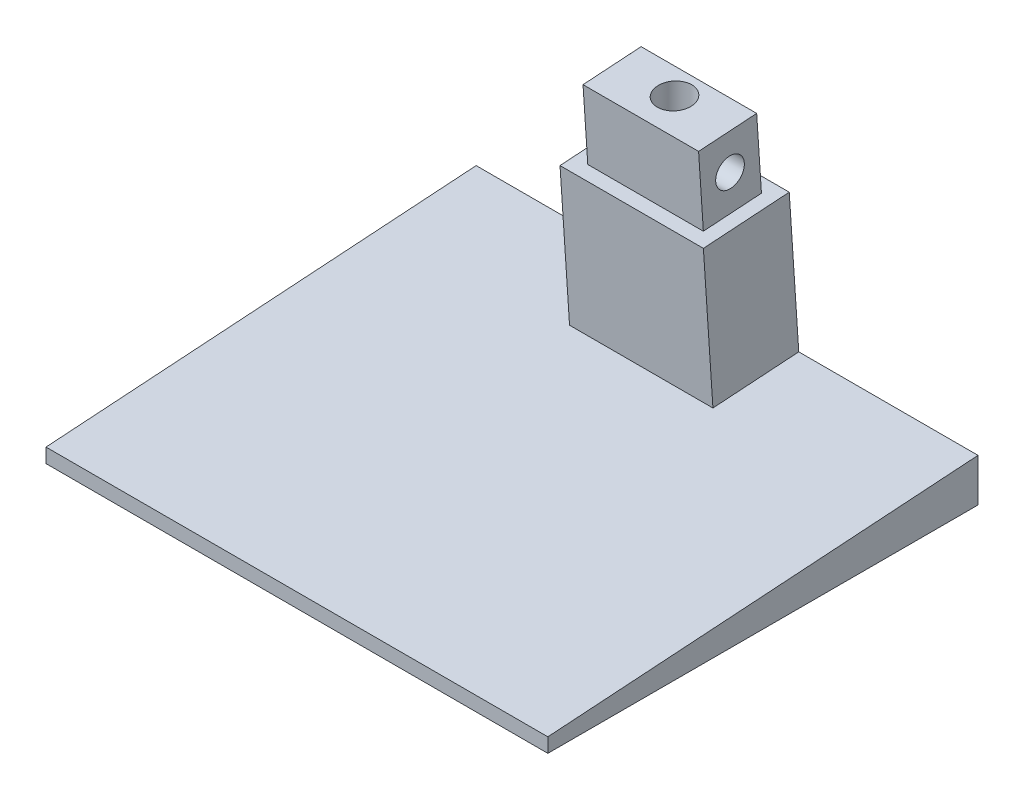
ISO-10303-21;
HEADER;
FILE_DESCRIPTION(('STEP AP214'),'2;1');
FILE_NAME('part.step','',(''),(''),'','','');
FILE_SCHEMA(('AUTOMOTIVE_DESIGN { 1 0 10303 214 1 1 1 1 }'));
ENDSEC;
DATA;
#1=APPLICATION_CONTEXT('core data for automotive mechanical design processes');
#2=APPLICATION_PROTOCOL_DEFINITION('international standard','automotive_design',2000,#1);
#3=PRODUCT_CONTEXT('',#1,'mechanical');
#4=PRODUCT('Part','Part','',(#3));
#5=PRODUCT_RELATED_PRODUCT_CATEGORY('part','',(#4));
#6=PRODUCT_DEFINITION_FORMATION('','',#4);
#7=PRODUCT_DEFINITION_CONTEXT('part definition',#1,'design');
#8=PRODUCT_DEFINITION('design','',#6,#7);
#9=PRODUCT_DEFINITION_SHAPE('','',#8);
#10=(LENGTH_UNIT() NAMED_UNIT(*) SI_UNIT(.MILLI.,.METRE.));
#11=(NAMED_UNIT(*) PLANE_ANGLE_UNIT() SI_UNIT($,.RADIAN.));
#12=(NAMED_UNIT(*) SI_UNIT($,.STERADIAN.) SOLID_ANGLE_UNIT());
#13=UNCERTAINTY_MEASURE_WITH_UNIT(LENGTH_MEASURE(1.E-05),#10,'distance_accuracy_value','');
#14=(GEOMETRIC_REPRESENTATION_CONTEXT(3) GLOBAL_UNCERTAINTY_ASSIGNED_CONTEXT((#13)) GLOBAL_UNIT_ASSIGNED_CONTEXT((#10,
#11,#12)) REPRESENTATION_CONTEXT('',''));
#15=CARTESIAN_POINT('',(0.,0.,0.));
#16=DIRECTION('',(0.,0.,1.));
#17=DIRECTION('',(1.,0.,0.));
#18=AXIS2_PLACEMENT_3D('',#15,#16,#17);
#19=CARTESIAN_POINT('',(87.5,89.5112696382054,-131.674049473811));
#20=DIRECTION('',(0.,-1.,0.));
#21=DIRECTION('',(0.,0.,-1.));
#22=AXIS2_PLACEMENT_3D('',#19,#20,#21);
#23=CYLINDRICAL_SURFACE('',#22,6.);
#24=CARTESIAN_POINT('',(89.042764725023,76.3637872081815,-125.875784474415));
#25=CARTESIAN_POINT('',(89.0427793697814,76.4502100416828,-125.875787073559));
#26=CARTESIAN_POINT('',(89.0513799306623,76.5366598300966,-125.878057289111));
#27=CARTESIAN_POINT('',(89.083725039843,76.7065794961056,-125.88681600111));
#28=CARTESIAN_POINT('',(89.1075283186484,76.7900364856621,-125.893320858536));
#29=CARTESIAN_POINT('',(89.1832372570854,77.0006443697118,-125.914798575622));
#30=CARTESIAN_POINT('',(89.243437313144,77.1244001643221,-125.932504957607));
#31=CARTESIAN_POINT('',(89.3779600846422,77.3626843112569,-125.975074709256));
#32=CARTESIAN_POINT('',(89.4523446075981,77.4771690338521,-125.999969656113));
#33=CARTESIAN_POINT('',(89.5888565013557,77.6714532492909,-126.049053985971));
#34=CARTESIAN_POINT('',(89.6493808497785,77.7527521945163,-126.071855224218));
#35=CARTESIAN_POINT('',(89.7730453914373,77.9122858190956,-126.120879714517));
#36=CARTESIAN_POINT('',(89.8361863734101,77.9905195604697,-126.147104003583));
#37=CARTESIAN_POINT('',(90.0280939689599,78.2216700704762,-126.230871617288));
#38=CARTESIAN_POINT('',(90.159198278557,78.3708380240515,-126.293458472662));
#39=CARTESIAN_POINT('',(90.4232084527442,78.6616777597919,-126.432176748635));
#40=CARTESIAN_POINT('',(90.5561177644259,78.8033315317511,-126.508338958104));
#41=CARTESIAN_POINT('',(90.8207832558745,79.079304043409,-126.674370995999));
#42=CARTESIAN_POINT('',(90.9525401912207,79.213627948104,-126.764230998362));
#43=CARTESIAN_POINT('',(91.2174019077664,79.4792033500319,-126.961396288291));
#44=CARTESIAN_POINT('',(91.3504031756903,79.6101998833002,-127.069186368991));
#45=CARTESIAN_POINT('',(91.6112659568959,79.8633263054801,-127.300503774454));
#46=CARTESIAN_POINT('',(91.7391253889881,79.9854526199212,-127.424037388824));
#47=CARTESIAN_POINT('',(91.9870947799801,80.2187652875163,-127.686763317388));
#48=CARTESIAN_POINT('',(92.1072353404672,80.3299958936156,-127.825886911498));
#49=CARTESIAN_POINT('',(92.3380346710194,80.5399773650568,-128.120396421846));
#50=CARTESIAN_POINT('',(92.4486965539099,80.6387323325334,-128.275776961727));
#51=CARTESIAN_POINT('',(92.6787722450169,80.8393024484906,-128.635257805519));
#52=CARTESIAN_POINT('',(92.795598839608,80.9378707301997,-128.84291973519));
#53=CARTESIAN_POINT('',(92.9539918553426,81.06539346973,-129.170305959201));
#54=CARTESIAN_POINT('',(93.0039949624662,81.1045219955819,-129.282121760007));
#55=CARTESIAN_POINT('',(93.0977471498935,81.1752937160671,-129.510615281535));
#56=CARTESIAN_POINT('',(93.1414992509541,81.2069405310609,-129.627290618472));
#57=CARTESIAN_POINT('',(93.2225070909228,81.2623118351067,-129.866024113515));
#58=CARTESIAN_POINT('',(93.2596967294545,81.2859576984858,-129.988123066503));
#59=CARTESIAN_POINT('',(93.3264588381164,81.3242298199294,-130.235716100821));
#60=CARTESIAN_POINT('',(93.3560353182682,81.3388608320023,-130.36120835617));
#61=CARTESIAN_POINT('',(93.4071191668175,81.3585708354973,-130.614508547043));
#62=CARTESIAN_POINT('',(93.4286305029332,81.3636545287543,-130.742315311395));
#63=CARTESIAN_POINT('',(93.4633180575324,81.3639146926371,-130.99906043758));
#64=CARTESIAN_POINT('',(93.4764954120776,81.3590925139803,-131.127998642747));
#65=CARTESIAN_POINT('',(93.4932904829129,81.3406798063257,-131.368921830528));
#66=CARTESIAN_POINT('',(93.4979281536621,81.3283104923028,-131.48093194983));
#67=CARTESIAN_POINT('',(93.5009621828291,81.2960075283034,-131.703977863105));
#68=CARTESIAN_POINT('',(93.4993565741161,81.2760714959933,-131.815013338941));
#69=CARTESIAN_POINT('',(93.4901335296254,81.2288060987739,-132.035208168448));
#70=CARTESIAN_POINT('',(93.482517965458,81.2014790373079,-132.144368095388));
#71=CARTESIAN_POINT('',(93.4616342523055,81.1397032002427,-132.360116521878));
#72=CARTESIAN_POINT('',(93.4483638882281,81.105251636566,-132.466703996444));
#73=CARTESIAN_POINT('',(93.4012688495116,80.9930475964702,-132.777855056129));
#74=CARTESIAN_POINT('',(93.3599585019667,80.905553038863,-132.977889341243));
#75=CARTESIAN_POINT('',(93.2612093792658,80.7074546362079,-133.361606792118));
#76=CARTESIAN_POINT('',(93.2037679448719,80.5968469816955,-133.545287255341));
#77=CARTESIAN_POINT('',(93.0681019017088,80.3381694064561,-133.919320757166));
#78=CARTESIAN_POINT('',(92.988079998529,80.1870043041771,-134.106872730576));
#79=CARTESIAN_POINT('',(92.8192905058662,79.861578133005,-134.456659360936));
#80=CARTESIAN_POINT('',(92.7305103426524,79.6872837311543,-134.618856728947));
#81=CARTESIAN_POINT('',(92.5873333167502,79.392265093154,-134.85679686639));
#82=CARTESIAN_POINT('',(92.5334304334385,79.2780993836818,-134.941119623344));
#83=CARTESIAN_POINT('',(92.4266626394211,79.0426248235883,-135.100001509976));
#84=CARTESIAN_POINT('',(92.3737979851985,78.9213142367806,-135.17455825223));
#85=CARTESIAN_POINT('',(92.2709855936435,78.6719377474253,-135.313439134306));
#86=CARTESIAN_POINT('',(92.2210351129625,78.5438784215003,-135.377772999432));
#87=CARTESIAN_POINT('',(92.1260328076876,78.2812042048557,-135.495770871212));
#88=CARTESIAN_POINT('',(92.0809813478239,78.1465888271194,-135.549434083687));
#89=CARTESIAN_POINT('',(91.9793551831933,77.8089915767957,-135.667028252658));
#90=CARTESIAN_POINT('',(91.9267140443316,77.6024973131042,-135.724717996542));
#91=CARTESIAN_POINT('',(91.864569417439,77.2856052634995,-135.79126222302));
#92=CARTESIAN_POINT('',(91.8466625809359,77.1788430002456,-135.81010706008));
#93=CARTESIAN_POINT('',(91.8171716104321,76.9634716570328,-135.8408815721));
#94=CARTESIAN_POINT('',(91.8055849237303,76.8548633409968,-135.85281403908));
#95=CARTESIAN_POINT('',(91.7892374263317,76.6358604220556,-135.869592569247));
#96=CARTESIAN_POINT('',(91.7845222145393,76.525458758446,-135.874391297335));
#97=CARTESIAN_POINT('',(91.7823034729202,76.3045085249741,-135.876653422798));
#98=CARTESIAN_POINT('',(91.7847997490606,76.1939599591443,-135.874117017531));
#99=CARTESIAN_POINT('',(91.7968786466895,75.9735946342982,-135.861758507338));
#100=CARTESIAN_POINT('',(91.8064658417063,75.8637783937664,-135.851931700207));
#101=CARTESIAN_POINT('',(91.832258127052,75.6457618156172,-135.825179686174));
#102=CARTESIAN_POINT('',(91.8484665934717,75.5375623315778,-135.808250857935));
#103=CARTESIAN_POINT('',(91.8895205253234,75.3081491301387,-135.76466398234));
#104=CARTESIAN_POINT('',(91.9152716854769,75.1872961862495,-135.736958328515));
#105=CARTESIAN_POINT('',(91.973156659891,74.949370818314,-135.673140467838));
#106=CARTESIAN_POINT('',(92.0052949272056,74.8323010984892,-135.637022392857));
#107=CARTESIAN_POINT('',(92.1093047060666,74.4871221881745,-135.516641012123));
#108=CARTESIAN_POINT('',(92.1887153028853,74.265323350972,-135.420405435627));
#109=CARTESIAN_POINT('',(92.3256899867539,73.9202584002824,-135.240608677925));
#110=CARTESIAN_POINT('',(92.3803542602527,73.7910986693754,-135.165709493764));
#111=CARTESIAN_POINT('',(92.4914022716153,73.5404060087576,-135.005029923144));
#112=CARTESIAN_POINT('',(92.5477864484522,73.4188750507651,-134.919246740795));
#113=CARTESIAN_POINT('',(92.6602804244272,73.1839333960836,-134.737209419358));
#114=CARTESIAN_POINT('',(92.7163903720206,73.0705177109517,-134.640961806031));
#115=CARTESIAN_POINT('',(92.8266074342102,72.8521882355313,-134.438210100854));
#116=CARTESIAN_POINT('',(92.880714158462,72.7472760975411,-134.33170402447));
#117=CARTESIAN_POINT('',(93.0211023470062,72.4777207667161,-134.032118330603));
#118=CARTESIAN_POINT('',(93.1040182999405,72.3214231986065,-133.829735174893));
#119=CARTESIAN_POINT('',(93.2512511650982,72.0393870850299,-133.398809076566));
#120=CARTESIAN_POINT('',(93.3155961124205,71.9136025228997,-133.170306300385));
#121=CARTESIAN_POINT('',(93.4103934427158,71.7140926897276,-132.727801817598));
#122=CARTESIAN_POINT('',(93.4445056970434,71.6353655295972,-132.516855500108));
#123=CARTESIAN_POINT('',(93.4899268206533,71.5067123153371,-132.083968715191));
#124=CARTESIAN_POINT('',(93.5012478753249,71.4567708810244,-131.862034187717));
#125=CARTESIAN_POINT('',(93.498529237956,71.387520504251,-131.41292467587));
#126=CARTESIAN_POINT('',(93.4844213276174,71.3682942224318,-131.185737213986));
#127=CARTESIAN_POINT('',(93.4302619374574,71.3606937006792,-130.733963086497));
#128=CARTESIAN_POINT('',(93.3902069111086,71.3723236789421,-130.509376780696));
#129=CARTESIAN_POINT('',(93.2879786364839,71.4232130103637,-130.078277226406));
#130=CARTESIAN_POINT('',(93.226750302558,71.4613529828175,-129.871400415414));
#131=CARTESIAN_POINT('',(93.0847309061696,71.5609117158367,-129.470404374638));
#132=CARTESIAN_POINT('',(93.0039346214463,71.6223366931415,-129.276288568102));
#133=CARTESIAN_POINT('',(92.8532489773755,71.7430801724324,-128.960500163987));
#134=CARTESIAN_POINT('',(92.7875557916468,71.7973209072322,-128.834798052083));
#135=CARTESIAN_POINT('',(92.6493642410879,71.9141646028293,-128.59124886658));
#136=CARTESIAN_POINT('',(92.5768637357943,71.9767701964709,-128.473404283721));
#137=CARTESIAN_POINT('',(92.3503165129829,72.1758422526004,-128.131564711146));
#138=CARTESIAN_POINT('',(92.1874365471843,72.323392015949,-127.919697282117));
#139=CARTESIAN_POINT('',(91.9002779617966,72.5899890603336,-127.591296443505));
#140=CARTESIAN_POINT('',(91.78026503774,72.7031091021879,-127.465914188388));
#141=CARTESIAN_POINT('',(91.5345807201537,72.9381928294041,-127.229824385662));
#142=CARTESIAN_POINT('',(91.4089098122007,73.0601557564026,-127.119115581958));
#143=CARTESIAN_POINT('',(91.1539565734457,73.3115402025332,-126.912167810475));
#144=CARTESIAN_POINT('',(91.0246822301156,73.4409458111717,-126.815899454946));
#145=CARTESIAN_POINT('',(90.7640802405881,73.7068447910888,-126.637114643248));
#146=CARTESIAN_POINT('',(90.6327534678216,73.843335201836,-126.554592502659));
#147=CARTESIAN_POINT('',(90.3709911767015,74.1226860386984,-126.40336443173));
#148=CARTESIAN_POINT('',(90.2405552481486,74.2655009976631,-126.334574862922));
#149=CARTESIAN_POINT('',(89.9820018081623,74.5603055240463,-126.20959438553));
#150=CARTESIAN_POINT('',(89.853901945097,74.712343133372,-126.153478210891));
#151=CARTESIAN_POINT('',(89.6679133152126,74.9503784169432,-126.078984418349));
#152=CARTESIAN_POINT('',(89.606492278457,75.0320600824545,-126.055624145567));
#153=CARTESIAN_POINT('',(89.4876146696114,75.1994164334142,-126.012479755685));
#154=CARTESIAN_POINT('',(89.4301640780741,75.2850968302593,-125.992700963655));
#155=CARTESIAN_POINT('',(89.3224890452551,75.4604477082431,-125.957258001398));
#156=CARTESIAN_POINT('',(89.2721925454176,75.5500644008068,-125.941551258192));
#157=CARTESIAN_POINT('',(89.1825028913054,75.7351087088759,-125.914590524554));
#158=CARTESIAN_POINT('',(89.1430694267735,75.8305131930963,-125.903320003635));
#159=CARTESIAN_POINT('',(89.0903189526855,75.9991694754137,-125.888600134851));
#160=CARTESIAN_POINT('',(89.0727561513652,76.0709350171623,-125.883835047407));
#161=CARTESIAN_POINT('',(89.0489849773978,76.2163925607287,-125.877429462102));
#162=CARTESIAN_POINT('',(89.0427522350013,76.2900800812092,-125.875782257692));
#163=CARTESIAN_POINT('',(89.042764725023,76.3637872081815,-125.875784474415));
#164=B_SPLINE_CURVE_WITH_KNOTS('',3,(#24,#25,#26,#27,#28,#29,#30,#31,#32,#33,#34,#35,#36,#37,
#38,#39,#40,#41,#42,#43,#44,#45,#46,#47,#48,#49,#50,#51,#52,#53,#54,#55,#56,#57,#58,#59,#60,#61,
#62,#63,#64,#65,#66,#67,#68,#69,#70,#71,#72,#73,#74,#75,#76,#77,#78,#79,#80,#81,#82,#83,#84,#85,
#86,#87,#88,#89,#90,#91,#92,#93,#94,#95,#96,#97,#98,#99,#100,#101,#102,#103,#104,#105,#106,#107,
#108,#109,#110,#111,#112,#113,#114,#115,#116,#117,#118,#119,#120,#121,#122,#123,#124,#125,#126,
#127,#128,#129,#130,#131,#132,#133,#134,#135,#136,#137,#138,#139,#140,#141,#142,#143,#144,#145,
#146,#147,#148,#149,#150,#151,#152,#153,#154,#155,#156,#157,#158,#159,#160,#161,#162,#163),
.UNSPECIFIED.,.T.,.F.,(4,2,2,2,2,2,2,2,2,2,2,2,2,2,2,2,2,2,2,2,2,2,2,2,2,2,2,2,2,2,2,2,2,2,2,2,
2,2,2,2,2,2,2,2,2,2,2,2,2,2,2,2,2,2,2,2,2,2,2,2,2,2,2,2,2,2,2,2,2,4),(0.,0.258939460754341,
0.518885346552173,0.932781526304068,1.34852422929801,1.66002717565653,1.97162471182371,
2.59557280496407,3.22095444692794,3.84588956659066,4.49182688386673,5.13802306949799,
5.78147526952643,6.42471534124918,7.19498086050797,7.58035933677063,7.96555094696234,
8.35442480468114,8.74309341271023,9.13157056013831,9.51999474018696,9.85793018679911,
10.1959721186341,10.5339088195263,10.8719780184876,11.5357161144331,12.1995636930633,
12.9583293394086,13.7182006089462,14.1732450000468,14.6284004256351,15.0831202229894,
15.537873850915,16.1972055767872,16.5265122976487,16.8556859132377,17.1870341220533,
17.5183734156653,17.8499266043396,18.1816490586315,18.5609781932637,18.9405727276454,
19.7006236723498,20.1771706396519,20.6538402715049,21.1302143324428,21.6066807353669,
22.4097193819052,23.2115393300283,23.8917715807372,24.57164004636,25.2533351108627,
25.9351233710986,26.5897451996233,27.2445419253764,27.6995111846975,28.1546239846935,
29.0663676031867,29.6871994571153,30.3079781315173,30.9274758005457,31.5467166515854,
32.1620625057289,32.7809473932841,33.0953051863714,33.4101266070102,33.7215101897899,
34.0317222380737,34.2530395879012,34.4738803418863),.UNSPECIFIED.);
#165=CARTESIAN_POINT('',(89.042764725023,76.3637872081815,-125.875784474415));
#166=VERTEX_POINT('',#165);
#167=EDGE_CURVE('E260',#166,#166,#164,.T.);
#168=ORIENTED_EDGE('',*,*,#167,.F.);
#169=EDGE_LOOP('',(#168));
#170=FACE_BOUND('',#169,.T.);
#171=CARTESIAN_POINT('',(85.957235274977,76.3637872081815,-125.875784474415));
#172=CARTESIAN_POINT('',(85.9572206302185,76.2773643746802,-125.875787073559));
#173=CARTESIAN_POINT('',(85.9486200693376,76.1909145862664,-125.878057289111));
#174=CARTESIAN_POINT('',(85.916274960157,76.0209949202573,-125.88681600111));
#175=CARTESIAN_POINT('',(85.8924716813516,75.9375379307008,-125.893320858536));
#176=CARTESIAN_POINT('',(85.8167627429146,75.7269300466512,-125.914798575622));
#177=CARTESIAN_POINT('',(85.756562686856,75.6031742520409,-125.932504957607));
#178=CARTESIAN_POINT('',(85.6220399153578,75.364890105106,-125.975074709256));
#179=CARTESIAN_POINT('',(85.5476553924019,75.2504053825109,-125.999969656113));
#180=CARTESIAN_POINT('',(85.4111434986443,75.056121167072,-126.049053985971));
#181=CARTESIAN_POINT('',(85.3506191502215,74.9748222218467,-126.071855224218));
#182=CARTESIAN_POINT('',(85.2269546085627,74.8152885972674,-126.120879714517));
#183=CARTESIAN_POINT('',(85.1638136265899,74.7370548558933,-126.147104003583));
#184=CARTESIAN_POINT('',(84.9719060310401,74.5059043458868,-126.230871617288));
#185=CARTESIAN_POINT('',(84.840801721443,74.3567363923115,-126.293458472662));
#186=CARTESIAN_POINT('',(84.5767915472558,74.065896656571,-126.432176748635));
#187=CARTESIAN_POINT('',(84.4438822355741,73.9242428846119,-126.508338958104));
#188=CARTESIAN_POINT('',(84.1792167441255,73.648270372954,-126.674370995999));
#189=CARTESIAN_POINT('',(84.0474598087793,73.513946468259,-126.764230998362));
#190=CARTESIAN_POINT('',(83.7825980922336,73.248371066331,-126.961396288291));
#191=CARTESIAN_POINT('',(83.6495968243098,73.1173745330627,-127.069186368991));
#192=CARTESIAN_POINT('',(83.3887340431041,72.8642481108829,-127.300503774454));
#193=CARTESIAN_POINT('',(83.260874611012,72.7421217964418,-127.424037388824));
#194=CARTESIAN_POINT('',(83.0129052200199,72.5088091288467,-127.686763317388));
#195=CARTESIAN_POINT('',(82.8927646595328,72.3975785227474,-127.825886911498));
#196=CARTESIAN_POINT('',(82.6619653289807,72.1875970513062,-128.120396421846));
#197=CARTESIAN_POINT('',(82.5513034460901,72.0888420838296,-128.275776961727));
#198=CARTESIAN_POINT('',(82.3212277549831,71.8882719678723,-128.635257805519));
#199=CARTESIAN_POINT('',(82.204401160392,71.7897036861633,-128.842919735189));
#200=CARTESIAN_POINT('',(82.0460081446574,71.662180946633,-129.1703059592));
#201=CARTESIAN_POINT('',(81.9960050375338,71.623052420781,-129.282121760006));
#202=CARTESIAN_POINT('',(81.9022528501065,71.5522807002958,-129.510615281535));
#203=CARTESIAN_POINT('',(81.8585007490459,71.5206338853021,-129.627290618472));
#204=CARTESIAN_POINT('',(81.7774929090772,71.4652625812562,-129.866024113514));
#205=CARTESIAN_POINT('',(81.7403032705455,71.4416167178772,-129.988123066503));
#206=CARTESIAN_POINT('',(81.6735411618836,71.4033445964336,-130.235716100821));
#207=CARTESIAN_POINT('',(81.6439646817318,71.3887135843606,-130.36120835617));
#208=CARTESIAN_POINT('',(81.5928808331825,71.3690035808657,-130.614508547043));
#209=CARTESIAN_POINT('',(81.5713694970668,71.3639198876086,-130.742315311395));
#210=CARTESIAN_POINT('',(81.5366819424676,71.3636597237259,-130.999060437579));
#211=CARTESIAN_POINT('',(81.5235045879223,71.3684819023826,-131.127998642747));
#212=CARTESIAN_POINT('',(81.5067095170871,71.3868946100373,-131.368921830528));
#213=CARTESIAN_POINT('',(81.5020718463378,71.3992639240602,-131.48093194983));
#214=CARTESIAN_POINT('',(81.4990378171709,71.4315668880596,-131.703977863105));
#215=CARTESIAN_POINT('',(81.5006434258839,71.4515029203697,-131.815013338941));
#216=CARTESIAN_POINT('',(81.5098664703746,71.498768317589,-132.035208168448));
#217=CARTESIAN_POINT('',(81.5174820345419,71.526095379055,-132.144368095388));
#218=CARTESIAN_POINT('',(81.5383657476945,71.5878712161202,-132.360116521878));
#219=CARTESIAN_POINT('',(81.5516361117719,71.622322779797,-132.466703996444));
#220=CARTESIAN_POINT('',(81.5987311504883,71.7345268198927,-132.777855056129));
#221=CARTESIAN_POINT('',(81.6400414980333,71.8220213775,-132.977889341243));
#222=CARTESIAN_POINT('',(81.7387906207342,72.020119780155,-133.361606792118));
#223=CARTESIAN_POINT('',(81.7962320551281,72.1307274346675,-133.545287255341));
#224=CARTESIAN_POINT('',(81.9318980982911,72.3894050099068,-133.919320757166));
#225=CARTESIAN_POINT('',(82.011920001471,72.5405701121858,-134.106872730576));
#226=CARTESIAN_POINT('',(82.1807094941337,72.8659962833579,-134.456659360936));
#227=CARTESIAN_POINT('',(82.2694896573475,73.0402906852086,-134.618856728947));
#228=CARTESIAN_POINT('',(82.4126666832498,73.3353093232089,-134.85679686639));
#229=CARTESIAN_POINT('',(82.4665695665615,73.4494750326811,-134.941119623343));
#230=CARTESIAN_POINT('',(82.5733373605789,73.6849495927746,-135.100001509975));
#231=CARTESIAN_POINT('',(82.6262020148015,73.8062601795823,-135.17455825223));
#232=CARTESIAN_POINT('',(82.7290144063565,74.0556366689376,-135.313439134306));
#233=CARTESIAN_POINT('',(82.7789648870375,74.1836959948626,-135.377772999432));
#234=CARTESIAN_POINT('',(82.8739671923124,74.4463702115072,-135.495770871212));
#235=CARTESIAN_POINT('',(82.9190186521761,74.5809855892435,-135.549434083687));
#236=CARTESIAN_POINT('',(83.0206448168066,74.9185828395672,-135.667028252658));
#237=CARTESIAN_POINT('',(83.0732859556684,75.1250771032587,-135.724717996542));
#238=CARTESIAN_POINT('',(83.1354305825609,75.4419691528634,-135.79126222302));
#239=CARTESIAN_POINT('',(83.1533374190641,75.5487314161173,-135.81010706008));
#240=CARTESIAN_POINT('',(83.1828283895679,75.7641027593301,-135.8408815721));
#241=CARTESIAN_POINT('',(83.1944150762696,75.8727110753661,-135.85281403908));
#242=CARTESIAN_POINT('',(83.2107625736682,76.0917139943073,-135.869592569247));
#243=CARTESIAN_POINT('',(83.2154777854607,76.2021156579169,-135.874391297335));
#244=CARTESIAN_POINT('',(83.2176965270798,76.4230658913888,-135.876653422798));
#245=CARTESIAN_POINT('',(83.2152002509394,76.5336144572185,-135.874117017531));
#246=CARTESIAN_POINT('',(83.2031213533104,76.7539797820647,-135.861758507338));
#247=CARTESIAN_POINT('',(83.1935341582937,76.8637960225966,-135.851931700207));
#248=CARTESIAN_POINT('',(83.167741872948,77.0818126007457,-135.825179686174));
#249=CARTESIAN_POINT('',(83.1515334065283,77.1900120847851,-135.808250857935));
#250=CARTESIAN_POINT('',(83.1104794746766,77.4194252862242,-135.76466398234));
#251=CARTESIAN_POINT('',(83.0847283145231,77.5402782301134,-135.736958328516));
#252=CARTESIAN_POINT('',(83.026843340109,77.7782035980489,-135.673140467839));
#253=CARTESIAN_POINT('',(82.9947050727945,77.8952733178737,-135.637022392857));
#254=CARTESIAN_POINT('',(82.8906952939334,78.2404522281883,-135.516641012123));
#255=CARTESIAN_POINT('',(82.8112846971147,78.4622510653909,-135.420405435627));
#256=CARTESIAN_POINT('',(82.6743100132461,78.8073160160804,-135.240608677925));
#257=CARTESIAN_POINT('',(82.6196457397474,78.9364757469875,-135.165709493764));
#258=CARTESIAN_POINT('',(82.5085977283848,79.1871684076052,-135.005029923144));
#259=CARTESIAN_POINT('',(82.4522135515478,79.3086993655978,-134.919246740795));
#260=CARTESIAN_POINT('',(82.3397195755728,79.5436410202793,-134.737209419358));
#261=CARTESIAN_POINT('',(82.2836096279794,79.6570567054112,-134.640961806031));
#262=CARTESIAN_POINT('',(82.1733925657898,79.8753861808315,-134.438210100855));
#263=CARTESIAN_POINT('',(82.119285841538,79.9802983188218,-134.33170402447));
#264=CARTESIAN_POINT('',(81.9788976529938,80.2498536496468,-134.032118330603));
#265=CARTESIAN_POINT('',(81.8959817000596,80.4061512177565,-133.829735174893));
#266=CARTESIAN_POINT('',(81.7487488349018,80.688187331333,-133.398809076566));
#267=CARTESIAN_POINT('',(81.6844038875795,80.8139718934632,-133.170306300386));
#268=CARTESIAN_POINT('',(81.5896065572842,81.0134817266354,-132.727801817598));
#269=CARTESIAN_POINT('',(81.5554943029566,81.0922088867657,-132.516855500108));
#270=CARTESIAN_POINT('',(81.5100731793467,81.2208621010258,-132.083968715191));
#271=CARTESIAN_POINT('',(81.4987521246751,81.2708035353385,-131.862034187717));
#272=CARTESIAN_POINT('',(81.501470762044,81.3400539121119,-131.41292467587));
#273=CARTESIAN_POINT('',(81.5155786723826,81.3592801939311,-131.185737213987));
#274=CARTESIAN_POINT('',(81.5697380625426,81.3668807156837,-130.733963086497));
#275=CARTESIAN_POINT('',(81.6097930888914,81.3552507374208,-130.509376780696));
#276=CARTESIAN_POINT('',(81.7120213635161,81.3043614059992,-130.078277226406));
#277=CARTESIAN_POINT('',(81.773249697442,81.2662214335455,-129.871400415414));
#278=CARTESIAN_POINT('',(81.9152690938304,81.1666627005263,-129.470404374638));
#279=CARTESIAN_POINT('',(81.9960653785537,81.1052377232214,-129.276288568102));
#280=CARTESIAN_POINT('',(82.1467510226245,80.9844942439306,-128.960500163987));
#281=CARTESIAN_POINT('',(82.2124442083531,80.9302535091308,-128.834798052083));
#282=CARTESIAN_POINT('',(82.3506357589121,80.8134098135337,-128.59124886658));
#283=CARTESIAN_POINT('',(82.4231362642057,80.7508042198921,-128.473404283721));
#284=CARTESIAN_POINT('',(82.649683487017,80.5517321637626,-128.131564711146));
#285=CARTESIAN_POINT('',(82.8125634528156,80.404182400414,-127.919697282117));
#286=CARTESIAN_POINT('',(83.0997220382034,80.1375853560294,-127.591296443505));
#287=CARTESIAN_POINT('',(83.21973496226,80.0244653141751,-127.465914188388));
#288=CARTESIAN_POINT('',(83.4654192798462,79.7893815869589,-127.229824385662));
#289=CARTESIAN_POINT('',(83.5910901877992,79.6674186599604,-127.119115581958));
#290=CARTESIAN_POINT('',(83.8460434265542,79.4160342138298,-126.912167810475));
#291=CARTESIAN_POINT('',(83.9753177698843,79.2866286051914,-126.815899454946));
#292=CARTESIAN_POINT('',(84.2359197594118,79.0207296252743,-126.637114643248));
#293=CARTESIAN_POINT('',(84.3672465321783,78.884239214527,-126.554592502659));
#294=CARTESIAN_POINT('',(84.6290088232984,78.6048883776646,-126.40336443173));
#295=CARTESIAN_POINT('',(84.7594447518513,78.4620734186999,-126.334574862922));
#296=CARTESIAN_POINT('',(85.0179981918377,78.1672688923167,-126.20959438553));
#297=CARTESIAN_POINT('',(85.146098054903,78.015231282991,-126.153478210891));
#298=CARTESIAN_POINT('',(85.3320866847873,77.7771959994198,-126.078984418349));
#299=CARTESIAN_POINT('',(85.393507721543,77.6955143339085,-126.055624145567));
#300=CARTESIAN_POINT('',(85.5123853303886,77.5281579829488,-126.012479755685));
#301=CARTESIAN_POINT('',(85.5698359219259,77.4424775861037,-125.992700963655));
#302=CARTESIAN_POINT('',(85.6775109547448,77.2671267081199,-125.957258001398));
#303=CARTESIAN_POINT('',(85.7278074545824,77.1775100155561,-125.941551258192));
#304=CARTESIAN_POINT('',(85.8174971086946,76.992465707487,-125.914590524554));
#305=CARTESIAN_POINT('',(85.8569305732265,76.8970612232666,-125.903320003635));
#306=CARTESIAN_POINT('',(85.9096810473145,76.7284049409493,-125.888600134851));
#307=CARTESIAN_POINT('',(85.9272438486348,76.6566393992006,-125.883835047407));
#308=CARTESIAN_POINT('',(85.9510150226022,76.5111818556343,-125.877429462102));
#309=CARTESIAN_POINT('',(85.9572477649987,76.4374943351537,-125.875782257692));
#310=CARTESIAN_POINT('',(85.957235274977,76.3637872081815,-125.875784474415));
#311=B_SPLINE_CURVE_WITH_KNOTS('',3,(#171,#172,#173,#174,#175,#176,#177,#178,#179,#180,#181,
#182,#183,#184,#185,#186,#187,#188,#189,#190,#191,#192,#193,#194,#195,#196,#197,#198,#199,#200,
#201,#202,#203,#204,#205,#206,#207,#208,#209,#210,#211,#212,#213,#214,#215,#216,#217,#218,#219,
#220,#221,#222,#223,#224,#225,#226,#227,#228,#229,#230,#231,#232,#233,#234,#235,#236,#237,#238,
#239,#240,#241,#242,#243,#244,#245,#246,#247,#248,#249,#250,#251,#252,#253,#254,#255,#256,#257,
#258,#259,#260,#261,#262,#263,#264,#265,#266,#267,#268,#269,#270,#271,#272,#273,#274,#275,#276,
#277,#278,#279,#280,#281,#282,#283,#284,#285,#286,#287,#288,#289,#290,#291,#292,#293,#294,#295,
#296,#297,#298,#299,#300,#301,#302,#303,#304,#305,#306,#307,#308,#309,#310),.UNSPECIFIED.,.T.,
.F.,(4,2,2,2,2,2,2,2,2,2,2,2,2,2,2,2,2,2,2,2,2,2,2,2,2,2,2,2,2,2,2,2,2,2,2,2,2,2,2,2,2,2,2,2,2,
2,2,2,2,2,2,2,2,2,2,2,2,2,2,2,2,2,2,2,2,2,2,2,2,4),(0.,0.258939460754338,0.518885346552171,
0.932781526304053,1.34852422929798,1.66002717565653,1.97162471182367,2.59557280496404,
3.2209544469279,3.84588956659061,4.49182688386667,5.13802306949792,5.78147526952636,
6.42471534124911,7.19498086050788,7.58035933677054,7.96555094696228,8.35442480468109,
8.74309341271018,9.13157056013826,9.51999474018693,9.85793018679908,10.1959721186341,
10.5339088195263,10.8719780184875,11.5357161144331,12.1995636930632,12.9583293394086,
13.7182006089461,14.1732450000467,14.628400425635,15.0831202229893,15.537873850915,
16.1972055767872,16.5265122976487,16.8556859132377,17.1870341220532,17.5183734156652,
17.8499266043396,18.1816490586314,18.5609781932636,18.9405727276453,19.7006236723497,
20.1771706396517,20.6538402715048,21.1302143324427,21.6066807353668,22.4097193819051,
23.2115393300282,23.8917715807371,24.57164004636,25.2533351108626,25.9351233710986,
26.5897451996232,27.2445419253763,27.6995111846974,28.1546239846935,29.0663676031866,
29.6871994571152,30.3079781315172,30.9274758005455,31.5467166515853,32.1620625057288,
32.7809473932841,33.0953051863714,33.4101266070102,33.72151018979,34.0317222380737,
34.2530395879012,34.4738803418863),.UNSPECIFIED.);
#312=CARTESIAN_POINT('',(85.957235274977,76.3637872081815,-125.875784474415));
#313=VERTEX_POINT('',#312);
#314=EDGE_CURVE('E252',#313,#313,#311,.T.);
#315=ORIENTED_EDGE('',*,*,#314,.F.);
#316=EDGE_LOOP('',(#315));
#317=FACE_BOUND('',#316,.T.);
#318=CARTESIAN_POINT('',(87.5,88.9447518567853,-131.674049473811));
#319=DIRECTION('',(0.,0.997785157856609,0.0665190105237737));
#320=DIRECTION('',(0.,-0.0665190105237737,0.997785157856609));
#321=AXIS2_PLACEMENT_3D('',#318,#319,#320);
#322=ELLIPSE('',#321,6.01331855134917,6.);
#323=CARTESIAN_POINT('',(87.5,88.5447518567853,-125.674049473811));
#324=VERTEX_POINT('',#323);
#325=EDGE_CURVE('E299',#324,#324,#322,.T.);
#326=ORIENTED_EDGE('',*,*,#325,.T.);
#327=EDGE_LOOP('',(#326));
#328=FACE_BOUND('',#327,.T.);
#329=CARTESIAN_POINT('',(87.5,12.5,-131.674049473811));
#330=DIRECTION('',(0.,-1.,0.));
#331=DIRECTION('',(0.,0.,-1.));
#332=AXIS2_PLACEMENT_3D('',#329,#330,#331);
#333=CIRCLE('',#332,6.);
#334=CARTESIAN_POINT('',(87.5,12.5,-137.674049473811));
#335=VERTEX_POINT('',#334);
#336=EDGE_CURVE('E47',#335,#335,#333,.F.);
#337=ORIENTED_EDGE('',*,*,#336,.F.);
#338=EDGE_LOOP('',(#337));
#339=FACE_BOUND('',#338,.T.);
#340=ADVANCED_FACE('F43',(#170,#317,#328,#339),#23,.F.);
#341=CARTESIAN_POINT('',(175.,76.3637872081815,-130.875784474415));
#342=DIRECTION('',(-1.,0.,0.));
#343=DIRECTION('',(0.,0.,1.));
#344=AXIS2_PLACEMENT_3D('',#341,#342,#343);
#345=CYLINDRICAL_SURFACE('',#344,5.00000000000002);
#346=ORIENTED_EDGE('',*,*,#167,.T.);
#347=EDGE_LOOP('',(#346));
#348=FACE_BOUND('',#347,.T.);
#349=CARTESIAN_POINT('',(107.65,76.3637872081815,-130.875784474415));
#350=DIRECTION('',(-1.,0.,0.));
#351=DIRECTION('',(0.,0.,1.));
#352=AXIS2_PLACEMENT_3D('',#349,#350,#351);
#353=CIRCLE('',#352,5.00000000000002);
#354=CARTESIAN_POINT('',(107.65,76.3637872081815,-125.875784474415));
#355=VERTEX_POINT('',#354);
#356=EDGE_CURVE('E247',#355,#355,#353,.T.);
#357=ORIENTED_EDGE('',*,*,#356,.F.);
#358=EDGE_LOOP('',(#357));
#359=FACE_BOUND('',#358,.T.);
#360=ADVANCED_FACE('F270',(#348,#359),#345,.F.);
#361=CARTESIAN_POINT('',(0.,15.,-150.));
#362=DIRECTION('',(0.,-0.997785157856609,-0.0665190105237739));
#363=DIRECTION('',(0.,0.0665190105237739,-0.997785157856609));
#364=AXIS2_PLACEMENT_3D('',#361,#362,#363);
#365=PLANE('',#364);
#366=DIRECTION('',(0.,-0.0665190105237739,0.997785157856609));
#367=VECTOR('',#366,1.);
#368=CARTESIAN_POINT('',(62.5,15.,-150.));
#369=LINE('',#368,#367);
#370=CARTESIAN_POINT('',(62.5,15.,-150.));
#371=VERTEX_POINT('',#370);
#372=CARTESIAN_POINT('',(62.5,13.0044296842868,-120.066445264302));
#373=VERTEX_POINT('',#372);
#374=EDGE_CURVE('E157',#371,#373,#369,.T.);
#375=ORIENTED_EDGE('',*,*,#374,.F.);
#376=DIRECTION('',(-1.,0.,0.));
#377=VECTOR('',#376,1.);
#378=CARTESIAN_POINT('',(0.,15.,-150.));
#379=LINE('',#378,#377);
#380=CARTESIAN_POINT('',(0.,15.,-150.));
#381=VERTEX_POINT('',#380);
#382=EDGE_CURVE('E224',#371,#381,#379,.T.);
#383=ORIENTED_EDGE('',*,*,#382,.T.);
#384=DIRECTION('',(0.,0.0665190105237739,-0.997785157856609));
#385=VECTOR('',#384,1.);
#386=CARTESIAN_POINT('',(0.,15.,-150.));
#387=LINE('',#386,#385);
#388=CARTESIAN_POINT('',(0.,5.,0.));
#389=VERTEX_POINT('',#388);
#390=EDGE_CURVE('E209',#389,#381,#387,.T.);
#391=ORIENTED_EDGE('',*,*,#390,.F.);
#392=DIRECTION('',(1.,0.,0.));
#393=VECTOR('',#392,1.);
#394=CARTESIAN_POINT('',(0.,5.,0.));
#395=LINE('',#394,#393);
#396=CARTESIAN_POINT('',(175.,5.,0.));
#397=VERTEX_POINT('',#396);
#398=EDGE_CURVE('E213',#389,#397,#395,.T.);
#399=ORIENTED_EDGE('',*,*,#398,.T.);
#400=DIRECTION('',(0.,0.0665190105237739,-0.997785157856609));
#401=VECTOR('',#400,1.);
#402=CARTESIAN_POINT('',(175.,15.,-150.));
#403=LINE('',#402,#401);
#404=CARTESIAN_POINT('',(175.,15.,-150.));
#405=VERTEX_POINT('',#404);
#406=EDGE_CURVE('E208',#397,#405,#403,.T.);
#407=ORIENTED_EDGE('',*,*,#406,.T.);
#408=CARTESIAN_POINT('',(112.5,15.,-150.));
#409=VERTEX_POINT('',#408);
#410=EDGE_CURVE('E219',#405,#409,#379,.T.);
#411=ORIENTED_EDGE('',*,*,#410,.T.);
#412=DIRECTION('',(0.,0.0665190105237739,-0.997785157856609));
#413=VECTOR('',#412,1.);
#414=CARTESIAN_POINT('',(112.5,15.,-150.));
#415=LINE('',#414,#413);
#416=CARTESIAN_POINT('',(112.5,13.0044296842868,-120.066445264302));
#417=VERTEX_POINT('',#416);
#418=EDGE_CURVE('E186',#417,#409,#415,.T.);
#419=ORIENTED_EDGE('',*,*,#418,.F.);
#420=DIRECTION('',(1.,0.,0.));
#421=VECTOR('',#420,1.);
#422=CARTESIAN_POINT('',(62.5,13.0044296842868,-120.066445264302));
#423=LINE('',#422,#421);
#424=EDGE_CURVE('E162',#373,#417,#423,.T.);
#425=ORIENTED_EDGE('',*,*,#424,.F.);
#426=EDGE_LOOP('',(#375,#383,#391,#399,#407,#411,#419,#425));
#427=FACE_BOUND('',#426,.T.);
#428=ADVANCED_FACE('F354',(#427),#365,.F.);
#429=CARTESIAN_POINT('',(0.,15.,0.));
#430=DIRECTION('',(1.,0.,0.));
#431=DIRECTION('',(0.,0.,-1.));
#432=AXIS2_PLACEMENT_3D('',#429,#430,#431);
#433=PLANE('',#432);
#434=DIRECTION('',(0.,-1.,0.));
#435=VECTOR('',#434,1.);
#436=CARTESIAN_POINT('',(0.,15.,0.));
#437=LINE('',#436,#435);
#438=CARTESIAN_POINT('',(0.,0.,0.));
#439=VERTEX_POINT('',#438);
#440=EDGE_CURVE('E11',#389,#439,#437,.T.);
#441=ORIENTED_EDGE('',*,*,#440,.F.);
#442=ORIENTED_EDGE('',*,*,#390,.T.);
#443=DIRECTION('',(0.,-1.,0.));
#444=VECTOR('',#443,1.);
#445=CARTESIAN_POINT('',(0.,15.,-150.));
#446=LINE('',#445,#444);
#447=CARTESIAN_POINT('',(0.,0.,-150.));
#448=VERTEX_POINT('',#447);
#449=EDGE_CURVE('E223',#381,#448,#446,.T.);
#450=ORIENTED_EDGE('',*,*,#449,.T.);
#451=DIRECTION('',(0.,0.,1.));
#452=VECTOR('',#451,1.);
#453=CARTESIAN_POINT('',(0.,0.,0.));
#454=LINE('',#453,#452);
#455=EDGE_CURVE('E218',#448,#439,#454,.T.);
#456=ORIENTED_EDGE('',*,*,#455,.T.);
#457=EDGE_LOOP('',(#441,#442,#450,#456));
#458=FACE_BOUND('',#457,.T.);
#459=ADVANCED_FACE('F45',(#458),#433,.F.);
#460=CARTESIAN_POINT('',(0.,15.,0.));
#461=DIRECTION('',(0.,0.,-1.));
#462=DIRECTION('',(-1.,0.,0.));
#463=AXIS2_PLACEMENT_3D('',#460,#461,#462);
#464=PLANE('',#463);
#465=DIRECTION('',(0.,-1.,0.));
#466=VECTOR('',#465,1.);
#467=CARTESIAN_POINT('',(175.,15.,0.));
#468=LINE('',#467,#466);
#469=CARTESIAN_POINT('',(175.,0.,0.));
#470=VERTEX_POINT('',#469);
#471=EDGE_CURVE('E53',#397,#470,#468,.T.);
#472=ORIENTED_EDGE('',*,*,#471,.F.);
#473=ORIENTED_EDGE('',*,*,#398,.F.);
#474=ORIENTED_EDGE('',*,*,#440,.T.);
#475=DIRECTION('',(1.,0.,0.));
#476=VECTOR('',#475,1.);
#477=CARTESIAN_POINT('',(0.,0.,0.));
#478=LINE('',#477,#476);
#479=EDGE_CURVE('E228',#439,#470,#478,.T.);
#480=ORIENTED_EDGE('',*,*,#479,.T.);
#481=EDGE_LOOP('',(#472,#473,#474,#480));
#482=FACE_BOUND('',#481,.T.);
#483=ADVANCED_FACE('F370',(#482),#464,.F.);
#484=CARTESIAN_POINT('',(175.,15.,0.));
#485=DIRECTION('',(-1.,0.,0.));
#486=DIRECTION('',(0.,0.,1.));
#487=AXIS2_PLACEMENT_3D('',#484,#485,#486);
#488=PLANE('',#487);
#489=DIRECTION('',(0.,-1.,0.));
#490=VECTOR('',#489,1.);
#491=CARTESIAN_POINT('',(175.,15.,-150.));
#492=LINE('',#491,#490);
#493=CARTESIAN_POINT('',(175.,0.,-150.));
#494=VERTEX_POINT('',#493);
#495=EDGE_CURVE('E241',#405,#494,#492,.T.);
#496=ORIENTED_EDGE('',*,*,#495,.F.);
#497=ORIENTED_EDGE('',*,*,#406,.F.);
#498=ORIENTED_EDGE('',*,*,#471,.T.);
#499=DIRECTION('',(0.,0.,-1.));
#500=VECTOR('',#499,1.);
#501=CARTESIAN_POINT('',(175.,0.,0.));
#502=LINE('',#501,#500);
#503=EDGE_CURVE('E232',#470,#494,#502,.T.);
#504=ORIENTED_EDGE('',*,*,#503,.T.);
#505=EDGE_LOOP('',(#496,#497,#498,#504));
#506=FACE_BOUND('',#505,.T.);
#507=ADVANCED_FACE('F360',(#506),#488,.F.);
#508=CARTESIAN_POINT('',(0.,15.,-150.));
#509=DIRECTION('',(0.,0.,1.));
#510=DIRECTION('',(1.,0.,0.));
#511=AXIS2_PLACEMENT_3D('',#508,#509,#510);
#512=PLANE('',#511);
#513=DIRECTION('',(-1.,0.,0.));
#514=VECTOR('',#513,1.);
#515=CARTESIAN_POINT('',(0.,0.,-150.));
#516=LINE('',#515,#514);
#517=EDGE_CURVE('E235',#494,#448,#516,.T.);
#518=ORIENTED_EDGE('',*,*,#517,.T.);
#519=ORIENTED_EDGE('',*,*,#449,.F.);
#520=ORIENTED_EDGE('',*,*,#382,.F.);
#521=DIRECTION('',(-1.,0.,0.));
#522=VECTOR('',#521,1.);
#523=CARTESIAN_POINT('',(62.5,15.,-150.));
#524=LINE('',#523,#522);
#525=EDGE_CURVE('E173',#409,#371,#524,.T.);
#526=ORIENTED_EDGE('',*,*,#525,.F.);
#527=ORIENTED_EDGE('',*,*,#410,.F.);
#528=ORIENTED_EDGE('',*,*,#495,.T.);
#529=EDGE_LOOP('',(#518,#519,#520,#526,#527,#528));
#530=FACE_BOUND('',#529,.T.);
#531=ADVANCED_FACE('F351',(#530),#512,.F.);
#532=CARTESIAN_POINT('',(0.,0.,0.));
#533=DIRECTION('',(0.,-1.,0.));
#534=DIRECTION('',(0.,0.,-1.));
#535=AXIS2_PLACEMENT_3D('',#532,#533,#534);
#536=PLANE('',#535);
#537=CARTESIAN_POINT('',(87.5,0.,-131.674049473811));
#538=DIRECTION('',(0.,-1.,0.));
#539=DIRECTION('',(0.,0.,-1.));
#540=AXIS2_PLACEMENT_3D('',#537,#538,#539);
#541=CIRCLE('',#540,12.5);
#542=CARTESIAN_POINT('',(87.5,0.,-144.174049473811));
#543=VERTEX_POINT('',#542);
#544=EDGE_CURVE('E293',#543,#543,#541,.T.);
#545=ORIENTED_EDGE('',*,*,#544,.F.);
#546=EDGE_LOOP('',(#545));
#547=FACE_BOUND('',#546,.T.);
#548=ORIENTED_EDGE('',*,*,#455,.F.);
#549=ORIENTED_EDGE('',*,*,#517,.F.);
#550=ORIENTED_EDGE('',*,*,#503,.F.);
#551=ORIENTED_EDGE('',*,*,#479,.F.);
#552=EDGE_LOOP('',(#548,#549,#550,#551));
#553=FACE_BOUND('',#552,.T.);
#554=ADVANCED_FACE('F365',(#547,#553),#536,.T.);
#555=CARTESIAN_POINT('',(62.5,64.8892578928305,-146.674049473811));
#556=DIRECTION('',(1.,0.,0.));
#557=DIRECTION('',(0.,0.,-1.));
#558=AXIS2_PLACEMENT_3D('',#555,#556,#557);
#559=PLANE('',#558);
#560=ORIENTED_EDGE('',*,*,#374,.T.);
#561=DIRECTION('',(0.,-0.997785157856609,-0.0665190105237739));
#562=VECTOR('',#561,1.);
#563=CARTESIAN_POINT('',(62.5,62.8936875771172,-116.740494738113));
#564=LINE('',#563,#562);
#565=CARTESIAN_POINT('',(62.5,62.8936875771172,-116.740494738113));
#566=VERTEX_POINT('',#565);
#567=EDGE_CURVE('E204',#566,#373,#564,.T.);
#568=ORIENTED_EDGE('',*,*,#567,.F.);
#569=DIRECTION('',(0.,-0.0665190105237739,0.997785157856609));
#570=VECTOR('',#569,1.);
#571=CARTESIAN_POINT('',(62.5,64.8892578928305,-146.674049473811));
#572=LINE('',#571,#570);
#573=CARTESIAN_POINT('',(62.5,64.8892578928305,-146.674049473811));
#574=VERTEX_POINT('',#573);
#575=EDGE_CURVE('E168',#574,#566,#572,.T.);
#576=ORIENTED_EDGE('',*,*,#575,.F.);
#577=DIRECTION('',(0.,-0.997785157856609,-0.0665190105237739));
#578=VECTOR('',#577,1.);
#579=CARTESIAN_POINT('',(62.5,64.8892578928305,-146.674049473811));
#580=LINE('',#579,#578);
#581=EDGE_CURVE('E181',#574,#371,#580,.T.);
#582=ORIENTED_EDGE('',*,*,#581,.T.);
#583=EDGE_LOOP('',(#560,#568,#576,#582));
#584=FACE_BOUND('',#583,.T.);
#585=ADVANCED_FACE('F340',(#584),#559,.F.);
#586=CARTESIAN_POINT('',(62.5,62.8936875771172,-116.740494738113));
#587=DIRECTION('',(0.,0.0665190105237739,-0.997785157856609));
#588=DIRECTION('',(0.,0.997785157856609,0.0665190105237739));
#589=AXIS2_PLACEMENT_3D('',#586,#587,#588);
#590=PLANE('',#589);
#591=ORIENTED_EDGE('',*,*,#424,.T.);
#592=DIRECTION('',(0.,-0.997785157856609,-0.0665190105237739));
#593=VECTOR('',#592,1.);
#594=CARTESIAN_POINT('',(112.5,62.8936875771172,-116.740494738113));
#595=LINE('',#594,#593);
#596=CARTESIAN_POINT('',(112.5,62.8936875771172,-116.740494738113));
#597=VERTEX_POINT('',#596);
#598=EDGE_CURVE('E200',#597,#417,#595,.T.);
#599=ORIENTED_EDGE('',*,*,#598,.F.);
#600=DIRECTION('',(1.,0.,0.));
#601=VECTOR('',#600,1.);
#602=CARTESIAN_POINT('',(62.5,62.8936875771172,-116.740494738113));
#603=LINE('',#602,#601);
#604=EDGE_CURVE('E172',#566,#597,#603,.T.);
#605=ORIENTED_EDGE('',*,*,#604,.F.);
#606=ORIENTED_EDGE('',*,*,#567,.T.);
#607=EDGE_LOOP('',(#591,#599,#605,#606));
#608=FACE_BOUND('',#607,.T.);
#609=ADVANCED_FACE('F342',(#608),#590,.F.);
#610=CARTESIAN_POINT('',(112.5,64.8892578928305,-146.674049473811));
#611=DIRECTION('',(-1.,0.,0.));
#612=DIRECTION('',(0.,0.,1.));
#613=AXIS2_PLACEMENT_3D('',#610,#611,#612);
#614=PLANE('',#613);
#615=ORIENTED_EDGE('',*,*,#418,.T.);
#616=DIRECTION('',(0.,-0.997785157856609,-0.0665190105237739));
#617=VECTOR('',#616,1.);
#618=CARTESIAN_POINT('',(112.5,64.8892578928305,-146.674049473811));
#619=LINE('',#618,#617);
#620=CARTESIAN_POINT('',(112.5,64.8892578928305,-146.674049473811));
#621=VERTEX_POINT('',#620);
#622=EDGE_CURVE('E196',#621,#409,#619,.T.);
#623=ORIENTED_EDGE('',*,*,#622,.F.);
#624=DIRECTION('',(0.,0.0665190105237739,-0.997785157856609));
#625=VECTOR('',#624,1.);
#626=CARTESIAN_POINT('',(112.5,64.8892578928305,-146.674049473811));
#627=LINE('',#626,#625);
#628=EDGE_CURVE('E176',#597,#621,#627,.T.);
#629=ORIENTED_EDGE('',*,*,#628,.F.);
#630=ORIENTED_EDGE('',*,*,#598,.T.);
#631=EDGE_LOOP('',(#615,#623,#629,#630));
#632=FACE_BOUND('',#631,.T.);
#633=ADVANCED_FACE('F346',(#632),#614,.F.);
#634=CARTESIAN_POINT('',(62.5,64.8892578928305,-146.674049473811));
#635=DIRECTION('',(0.,-0.0665190105237739,0.997785157856609));
#636=DIRECTION('',(0.,-0.997785157856609,-0.0665190105237739));
#637=AXIS2_PLACEMENT_3D('',#634,#635,#636);
#638=PLANE('',#637);
#639=ORIENTED_EDGE('',*,*,#525,.T.);
#640=ORIENTED_EDGE('',*,*,#581,.F.);
#641=DIRECTION('',(-1.,0.,0.));
#642=VECTOR('',#641,1.);
#643=CARTESIAN_POINT('',(62.5,64.8892578928305,-146.674049473811));
#644=LINE('',#643,#642);
#645=EDGE_CURVE('E179',#621,#574,#644,.T.);
#646=ORIENTED_EDGE('',*,*,#645,.F.);
#647=ORIENTED_EDGE('',*,*,#622,.T.);
#648=EDGE_LOOP('',(#639,#640,#646,#647));
#649=FACE_BOUND('',#648,.T.);
#650=ADVANCED_FACE('F332',(#649),#638,.F.);
#651=CARTESIAN_POINT('',(0.,54.8671339990251,3.65780893326834));
#652=DIRECTION('',(0.,0.997785157856609,0.0665190105237739));
#653=DIRECTION('',(0.,-0.0665190105237739,0.997785157856609));
#654=AXIS2_PLACEMENT_3D('',#651,#652,#653);
#655=PLANE('',#654);
#656=DIRECTION('',(0.,-0.0665190105237737,0.997785157856609));
#657=VECTOR('',#656,1.);
#658=CARTESIAN_POINT('',(67.35,64.5666406917902,-141.834791458207));
#659=LINE('',#658,#657);
#660=CARTESIAN_POINT('',(67.35,64.5666406917902,-141.834791458207));
#661=VERTEX_POINT('',#660);
#662=CARTESIAN_POINT('',(67.35,63.2163047781576,-121.579752753718));
#663=VERTEX_POINT('',#662);
#664=EDGE_CURVE('E61',#661,#663,#659,.T.);
#665=ORIENTED_EDGE('',*,*,#664,.F.);
#666=DIRECTION('',(-1.,0.,0.));
#667=VECTOR('',#666,1.);
#668=CARTESIAN_POINT('',(67.35,64.5666406917902,-141.834791458207));
#669=LINE('',#668,#667);
#670=CARTESIAN_POINT('',(107.65,64.5666406917902,-141.834791458207));
#671=VERTEX_POINT('',#670);
#672=EDGE_CURVE('E65',#671,#661,#669,.T.);
#673=ORIENTED_EDGE('',*,*,#672,.F.);
#674=DIRECTION('',(0.,0.0665190105237737,-0.997785157856609));
#675=VECTOR('',#674,1.);
#676=CARTESIAN_POINT('',(107.65,64.5666406917902,-141.834791458207));
#677=LINE('',#676,#675);
#678=CARTESIAN_POINT('',(107.65,63.2163047781576,-121.579752753718));
#679=VERTEX_POINT('',#678);
#680=EDGE_CURVE('E316',#679,#671,#677,.T.);
#681=ORIENTED_EDGE('',*,*,#680,.F.);
#682=DIRECTION('',(1.,0.,0.));
#683=VECTOR('',#682,1.);
#684=CARTESIAN_POINT('',(67.35,63.2163047781576,-121.579752753718));
#685=LINE('',#684,#683);
#686=EDGE_CURVE('E313',#663,#679,#685,.T.);
#687=ORIENTED_EDGE('',*,*,#686,.F.);
#688=EDGE_LOOP('',(#665,#673,#681,#687));
#689=FACE_BOUND('',#688,.T.);
#690=ORIENTED_EDGE('',*,*,#575,.T.);
#691=ORIENTED_EDGE('',*,*,#604,.T.);
#692=ORIENTED_EDGE('',*,*,#628,.T.);
#693=ORIENTED_EDGE('',*,*,#645,.T.);
#694=EDGE_LOOP('',(#690,#691,#692,#693));
#695=FACE_BOUND('',#694,.T.);
#696=ADVANCED_FACE('F329',(#689,#695),#655,.T.);
#697=CARTESIAN_POINT('',(67.35,89.5112696382054,-140.171816195112));
#698=DIRECTION('',(1.,0.,0.));
#699=DIRECTION('',(0.,0.,-1.));
#700=AXIS2_PLACEMENT_3D('',#697,#698,#699);
#701=PLANE('',#700);
#702=CARTESIAN_POINT('',(67.35,76.3637872081815,-130.875784474415));
#703=DIRECTION('',(-1.,0.,0.));
#704=DIRECTION('',(0.,0.,1.));
#705=AXIS2_PLACEMENT_3D('',#702,#703,#704);
#706=CIRCLE('',#705,5.00000000000002);
#707=CARTESIAN_POINT('',(67.35,76.3637872081815,-125.875784474415));
#708=VERTEX_POINT('',#707);
#709=EDGE_CURVE('E251',#708,#708,#706,.T.);
#710=ORIENTED_EDGE('',*,*,#709,.F.);
#711=EDGE_LOOP('',(#710));
#712=FACE_BOUND('',#711,.T.);
#713=ORIENTED_EDGE('',*,*,#664,.T.);
#714=DIRECTION('',(0.,-0.997785157856609,-0.0665190105237739));
#715=VECTOR('',#714,1.);
#716=CARTESIAN_POINT('',(67.35,88.1609337245728,-119.916777490623));
#717=LINE('',#716,#715);
#718=CARTESIAN_POINT('',(67.35,88.1609337245728,-119.916777490623));
#719=VERTEX_POINT('',#718);
#720=EDGE_CURVE('E137',#719,#663,#717,.T.);
#721=ORIENTED_EDGE('',*,*,#720,.F.);
#722=DIRECTION('',(0.,-0.0665190105237737,0.997785157856609));
#723=VECTOR('',#722,1.);
#724=CARTESIAN_POINT('',(67.35,89.5112696382054,-140.171816195112));
#725=LINE('',#724,#723);
#726=CARTESIAN_POINT('',(67.35,89.5112696382054,-140.171816195112));
#727=VERTEX_POINT('',#726);
#728=EDGE_CURVE('E144',#727,#719,#725,.T.);
#729=ORIENTED_EDGE('',*,*,#728,.F.);
#730=DIRECTION('',(0.,-0.997785157856609,-0.0665190105237739));
#731=VECTOR('',#730,1.);
#732=CARTESIAN_POINT('',(67.35,89.5112696382054,-140.171816195112));
#733=LINE('',#732,#731);
#734=EDGE_CURVE('E310',#727,#661,#733,.T.);
#735=ORIENTED_EDGE('',*,*,#734,.T.);
#736=EDGE_LOOP('',(#713,#721,#729,#735));
#737=FACE_BOUND('',#736,.T.);
#738=ADVANCED_FACE('F155',(#712,#737),#701,.F.);
#739=CARTESIAN_POINT('',(67.35,88.1609337245728,-119.916777490623));
#740=DIRECTION('',(0.,0.0665190105237739,-0.997785157856609));
#741=DIRECTION('',(0.,0.997785157856609,0.0665190105237739));
#742=AXIS2_PLACEMENT_3D('',#739,#740,#741);
#743=PLANE('',#742);
#744=ORIENTED_EDGE('',*,*,#686,.T.);
#745=DIRECTION('',(0.,-0.997785157856609,-0.0665190105237739));
#746=VECTOR('',#745,1.);
#747=CARTESIAN_POINT('',(107.65,88.1609337245728,-119.916777490623));
#748=LINE('',#747,#746);
#749=CARTESIAN_POINT('',(107.65,88.1609337245728,-119.916777490623));
#750=VERTEX_POINT('',#749);
#751=EDGE_CURVE('E139',#750,#679,#748,.T.);
#752=ORIENTED_EDGE('',*,*,#751,.F.);
#753=DIRECTION('',(1.,0.,0.));
#754=VECTOR('',#753,1.);
#755=CARTESIAN_POINT('',(67.35,88.1609337245728,-119.916777490623));
#756=LINE('',#755,#754);
#757=EDGE_CURVE('E132',#719,#750,#756,.T.);
#758=ORIENTED_EDGE('',*,*,#757,.F.);
#759=ORIENTED_EDGE('',*,*,#720,.T.);
#760=EDGE_LOOP('',(#744,#752,#758,#759));
#761=FACE_BOUND('',#760,.T.);
#762=ADVANCED_FACE('F135',(#761),#743,.F.);
#763=CARTESIAN_POINT('',(107.65,89.5112696382054,-140.171816195112));
#764=DIRECTION('',(-1.,0.,0.));
#765=DIRECTION('',(0.,0.,1.));
#766=AXIS2_PLACEMENT_3D('',#763,#764,#765);
#767=PLANE('',#766);
#768=ORIENTED_EDGE('',*,*,#356,.T.);
#769=EDGE_LOOP('',(#768));
#770=FACE_BOUND('',#769,.T.);
#771=ORIENTED_EDGE('',*,*,#680,.T.);
#772=DIRECTION('',(0.,-0.997785157856609,-0.0665190105237739));
#773=VECTOR('',#772,1.);
#774=CARTESIAN_POINT('',(107.65,89.5112696382054,-140.171816195112));
#775=LINE('',#774,#773);
#776=CARTESIAN_POINT('',(107.65,89.5112696382054,-140.171816195112));
#777=VERTEX_POINT('',#776);
#778=EDGE_CURVE('E164',#777,#671,#775,.T.);
#779=ORIENTED_EDGE('',*,*,#778,.F.);
#780=DIRECTION('',(0.,0.0665190105237737,-0.997785157856609));
#781=VECTOR('',#780,1.);
#782=CARTESIAN_POINT('',(107.65,89.5112696382054,-140.171816195112));
#783=LINE('',#782,#781);
#784=EDGE_CURVE('E143',#750,#777,#783,.T.);
#785=ORIENTED_EDGE('',*,*,#784,.F.);
#786=ORIENTED_EDGE('',*,*,#751,.T.);
#787=EDGE_LOOP('',(#771,#779,#785,#786));
#788=FACE_BOUND('',#787,.T.);
#789=ADVANCED_FACE('F328',(#770,#788),#767,.F.);
#790=CARTESIAN_POINT('',(67.35,89.5112696382054,-140.171816195112));
#791=DIRECTION('',(0.,-0.0665190105237739,0.997785157856609));
#792=DIRECTION('',(0.,-0.997785157856609,-0.0665190105237739));
#793=AXIS2_PLACEMENT_3D('',#790,#791,#792);
#794=PLANE('',#793);
#795=ORIENTED_EDGE('',*,*,#672,.T.);
#796=ORIENTED_EDGE('',*,*,#734,.F.);
#797=DIRECTION('',(-1.,0.,0.));
#798=VECTOR('',#797,1.);
#799=CARTESIAN_POINT('',(67.35,89.5112696382054,-140.171816195112));
#800=LINE('',#799,#798);
#801=EDGE_CURVE('E149',#777,#727,#800,.T.);
#802=ORIENTED_EDGE('',*,*,#801,.F.);
#803=ORIENTED_EDGE('',*,*,#778,.T.);
#804=EDGE_LOOP('',(#795,#796,#802,#803));
#805=FACE_BOUND('',#804,.T.);
#806=ADVANCED_FACE('F326',(#805),#794,.F.);
#807=CARTESIAN_POINT('',(0.,79.8117629454404,5.32078419636268));
#808=DIRECTION('',(0.,0.997785157856609,0.0665190105237737));
#809=DIRECTION('',(0.,-0.0665190105237737,0.997785157856609));
#810=AXIS2_PLACEMENT_3D('',#807,#808,#809);
#811=PLANE('',#810);
#812=ORIENTED_EDGE('',*,*,#325,.F.);
#813=EDGE_LOOP('',(#812));
#814=FACE_BOUND('',#813,.T.);
#815=ORIENTED_EDGE('',*,*,#728,.T.);
#816=ORIENTED_EDGE('',*,*,#757,.T.);
#817=ORIENTED_EDGE('',*,*,#784,.T.);
#818=ORIENTED_EDGE('',*,*,#801,.T.);
#819=EDGE_LOOP('',(#815,#816,#817,#818));
#820=FACE_BOUND('',#819,.T.);
#821=ADVANCED_FACE('F147',(#814,#820),#811,.T.);
#822=ORIENTED_EDGE('',*,*,#314,.T.);
#823=EDGE_LOOP('',(#822));
#824=FACE_BOUND('',#823,.T.);
#825=ORIENTED_EDGE('',*,*,#709,.T.);
#826=EDGE_LOOP('',(#825));
#827=FACE_BOUND('',#826,.T.);
#828=ADVANCED_FACE('F264',(#824,#827),#345,.F.);
#829=CARTESIAN_POINT('',(87.5,12.5,-131.674049473811));
#830=DIRECTION('',(0.,-1.,0.));
#831=DIRECTION('',(0.,0.,-1.));
#832=AXIS2_PLACEMENT_3D('',#829,#830,#831);
#833=PLANE('',#832);
#834=CARTESIAN_POINT('',(87.5,12.5,-131.674049473811));
#835=DIRECTION('',(0.,-1.,0.));
#836=DIRECTION('',(0.,0.,-1.));
#837=AXIS2_PLACEMENT_3D('',#834,#835,#836);
#838=CIRCLE('',#837,12.5);
#839=CARTESIAN_POINT('',(87.5,12.5,-144.174049473811));
#840=VERTEX_POINT('',#839);
#841=EDGE_CURVE('E287',#840,#840,#838,.T.);
#842=ORIENTED_EDGE('',*,*,#841,.T.);
#843=EDGE_LOOP('',(#842));
#844=FACE_BOUND('',#843,.T.);
#845=ORIENTED_EDGE('',*,*,#336,.T.);
#846=EDGE_LOOP('',(#845));
#847=FACE_BOUND('',#846,.T.);
#848=ADVANCED_FACE('F276',(#844,#847),#833,.T.);
#849=CARTESIAN_POINT('',(87.5,12.5,-131.674049473811));
#850=DIRECTION('',(0.,-1.,0.));
#851=DIRECTION('',(0.,0.,-1.));
#852=AXIS2_PLACEMENT_3D('',#849,#850,#851);
#853=CYLINDRICAL_SURFACE('',#852,12.5);
#854=ORIENTED_EDGE('',*,*,#841,.F.);
#855=EDGE_LOOP('',(#854));
#856=FACE_BOUND('',#855,.T.);
#857=ORIENTED_EDGE('',*,*,#544,.T.);
#858=EDGE_LOOP('',(#857));
#859=FACE_BOUND('',#858,.T.);
#860=ADVANCED_FACE('F272',(#856,#859),#853,.F.);
#861=CLOSED_SHELL('',(#340,#360,#428,#459,#483,#507,#531,#554,#585,#609,#633,#650,#696,#738,
#762,#789,#806,#821,#828,#848,#860));
#862=MANIFOLD_SOLID_BREP('B2',#861);
#863=ADVANCED_BREP_SHAPE_REPRESENTATION('',(#18,#862),#14);
#864=SHAPE_DEFINITION_REPRESENTATION(#9,#863);
ENDSEC;
END-ISO-10303-21;
